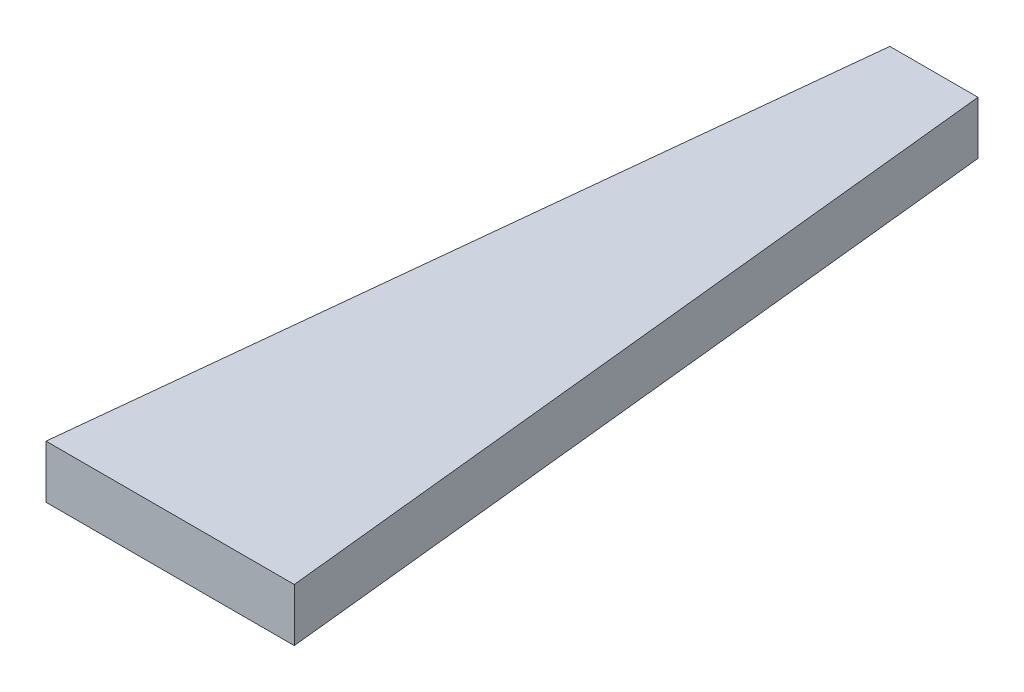
ISO-10303-21;
HEADER;
FILE_DESCRIPTION(('STEP AP214'),'2;1');
FILE_NAME('part.step','',(''),(''),'','','');
FILE_SCHEMA(('AUTOMOTIVE_DESIGN { 1 0 10303 214 1 1 1 1 }'));
ENDSEC;
DATA;
#1=APPLICATION_CONTEXT('core data for automotive mechanical design processes');
#2=APPLICATION_PROTOCOL_DEFINITION('international standard','automotive_design',2000,#1);
#3=PRODUCT_CONTEXT('',#1,'mechanical');
#4=PRODUCT('Part','Part','',(#3));
#5=PRODUCT_RELATED_PRODUCT_CATEGORY('part','',(#4));
#6=PRODUCT_DEFINITION_FORMATION('','',#4);
#7=PRODUCT_DEFINITION_CONTEXT('part definition',#1,'design');
#8=PRODUCT_DEFINITION('design','',#6,#7);
#9=PRODUCT_DEFINITION_SHAPE('','',#8);
#10=(LENGTH_UNIT() NAMED_UNIT(*) SI_UNIT(.MILLI.,.METRE.));
#11=(NAMED_UNIT(*) PLANE_ANGLE_UNIT() SI_UNIT($,.RADIAN.));
#12=(NAMED_UNIT(*) SI_UNIT($,.STERADIAN.) SOLID_ANGLE_UNIT());
#13=UNCERTAINTY_MEASURE_WITH_UNIT(LENGTH_MEASURE(1.E-05),#10,'distance_accuracy_value','');
#14=(GEOMETRIC_REPRESENTATION_CONTEXT(3) GLOBAL_UNCERTAINTY_ASSIGNED_CONTEXT((#13)) GLOBAL_UNIT_ASSIGNED_CONTEXT((#10,
#11,#12)) REPRESENTATION_CONTEXT('',''));
#15=CARTESIAN_POINT('',(0.,0.,0.));
#16=DIRECTION('',(0.,0.,1.));
#17=DIRECTION('',(1.,0.,0.));
#18=AXIS2_PLACEMENT_3D('',#15,#16,#17);
#19=CARTESIAN_POINT('',(29.7693471621072,6.35,0.));
#20=DIRECTION('',(0.,0.,-1.));
#21=DIRECTION('',(-1.,0.,0.));
#22=AXIS2_PLACEMENT_3D('',#19,#20,#21);
#23=PLANE('',#22);
#24=DIRECTION('',(1.,0.,0.));
#25=VECTOR('',#24,1.);
#26=CARTESIAN_POINT('',(29.7693471621072,0.,0.));
#27=LINE('',#26,#25);
#28=CARTESIAN_POINT('',(0.,0.,0.));
#29=VERTEX_POINT('',#28);
#30=CARTESIAN_POINT('',(29.7693471621072,0.,0.));
#31=VERTEX_POINT('',#30);
#32=EDGE_CURVE('E96',#29,#31,#27,.T.);
#33=ORIENTED_EDGE('',*,*,#32,.T.);
#34=DIRECTION('',(0.,-1.,0.));
#35=VECTOR('',#34,1.);
#36=CARTESIAN_POINT('',(29.7693471621072,6.35,0.));
#37=LINE('',#36,#35);
#38=CARTESIAN_POINT('',(29.7693471621072,6.35,0.));
#39=VERTEX_POINT('',#38);
#40=EDGE_CURVE('E11',#39,#31,#37,.T.);
#41=ORIENTED_EDGE('',*,*,#40,.F.);
#42=DIRECTION('',(1.,0.,0.));
#43=VECTOR('',#42,1.);
#44=CARTESIAN_POINT('',(29.7693471621072,6.35,0.));
#45=LINE('',#44,#43);
#46=CARTESIAN_POINT('',(0.,6.35,0.));
#47=VERTEX_POINT('',#46);
#48=EDGE_CURVE('E84',#47,#39,#45,.T.);
#49=ORIENTED_EDGE('',*,*,#48,.F.);
#50=DIRECTION('',(0.,-1.,0.));
#51=VECTOR('',#50,1.);
#52=CARTESIAN_POINT('',(0.,6.35,0.));
#53=LINE('',#52,#51);
#54=EDGE_CURVE('E92',#47,#29,#53,.T.);
#55=ORIENTED_EDGE('',*,*,#54,.T.);
#56=EDGE_LOOP('',(#33,#41,#49,#55));
#57=FACE_BOUND('',#56,.T.);
#58=ADVANCED_FACE('F33',(#57),#23,.F.);
#59=CARTESIAN_POINT('',(20.1696103395712,6.35,-91.5813479250892));
#60=DIRECTION('',(-0.994551040386204,0.,0.104250794081961));
#61=DIRECTION('',(0.104250794081961,0.,0.994551040386204));
#62=AXIS2_PLACEMENT_3D('',#59,#60,#61);
#63=PLANE('',#62);
#64=DIRECTION('',(-0.104250794081961,0.,-0.994551040386204));
#65=VECTOR('',#64,1.);
#66=CARTESIAN_POINT('',(20.1696103395712,0.,-91.5813479250892));
#67=LINE('',#66,#65);
#68=CARTESIAN_POINT('',(20.1696103395712,0.,-91.5813479250892));
#69=VERTEX_POINT('',#68);
#70=EDGE_CURVE('E88',#31,#69,#67,.T.);
#71=ORIENTED_EDGE('',*,*,#70,.T.);
#72=DIRECTION('',(0.,-1.,0.));
#73=VECTOR('',#72,1.);
#74=CARTESIAN_POINT('',(20.1696103395712,6.35,-91.5813479250892));
#75=LINE('',#74,#73);
#76=CARTESIAN_POINT('',(20.1696103395712,6.35,-91.5813479250892));
#77=VERTEX_POINT('',#76);
#78=EDGE_CURVE('E41',#77,#69,#75,.T.);
#79=ORIENTED_EDGE('',*,*,#78,.F.);
#80=DIRECTION('',(-0.104250794081961,0.,-0.994551040386204));
#81=VECTOR('',#80,1.);
#82=CARTESIAN_POINT('',(20.1696103395712,6.35,-91.5813479250892));
#83=LINE('',#82,#81);
#84=EDGE_CURVE('E79',#39,#77,#83,.T.);
#85=ORIENTED_EDGE('',*,*,#84,.F.);
#86=ORIENTED_EDGE('',*,*,#40,.T.);
#87=EDGE_LOOP('',(#71,#79,#85,#86));
#88=FACE_BOUND('',#87,.T.);
#89=ADVANCED_FACE('F87',(#88),#63,.F.);
#90=CARTESIAN_POINT('',(9.59973682253633,6.35,-91.5813479250891));
#91=DIRECTION('',(0.,0.,1.));
#92=DIRECTION('',(1.,0.,0.));
#93=AXIS2_PLACEMENT_3D('',#90,#91,#92);
#94=PLANE('',#93);
#95=DIRECTION('',(-1.,0.,0.));
#96=VECTOR('',#95,1.);
#97=CARTESIAN_POINT('',(9.59973682253633,0.,-91.5813479250891));
#98=LINE('',#97,#96);
#99=CARTESIAN_POINT('',(9.59973682253633,0.,-91.5813479250891));
#100=VERTEX_POINT('',#99);
#101=EDGE_CURVE('E66',#69,#100,#98,.T.);
#102=ORIENTED_EDGE('',*,*,#101,.T.);
#103=DIRECTION('',(0.,-1.,0.));
#104=VECTOR('',#103,1.);
#105=CARTESIAN_POINT('',(9.59973682253633,6.35,-91.5813479250891));
#106=LINE('',#105,#104);
#107=CARTESIAN_POINT('',(9.59973682253633,6.35,-91.5813479250891));
#108=VERTEX_POINT('',#107);
#109=EDGE_CURVE('E89',#108,#100,#106,.T.);
#110=ORIENTED_EDGE('',*,*,#109,.F.);
#111=DIRECTION('',(-1.,0.,0.));
#112=VECTOR('',#111,1.);
#113=CARTESIAN_POINT('',(9.59973682253633,6.35,-91.5813479250891));
#114=LINE('',#113,#112);
#115=EDGE_CURVE('E82',#77,#108,#114,.T.);
#116=ORIENTED_EDGE('',*,*,#115,.F.);
#117=ORIENTED_EDGE('',*,*,#78,.T.);
#118=EDGE_LOOP('',(#102,#110,#116,#117));
#119=FACE_BOUND('',#118,.T.);
#120=ADVANCED_FACE('F90',(#119),#94,.F.);
#121=CARTESIAN_POINT('',(0.,6.35,0.));
#122=DIRECTION('',(0.994551040386203,0.,0.104250794081965));
#123=DIRECTION('',(0.104250794081965,0.,-0.994551040386204));
#124=AXIS2_PLACEMENT_3D('',#121,#122,#123);
#125=PLANE('',#124);
#126=DIRECTION('',(-0.104250794081965,0.,0.994551040386203));
#127=VECTOR('',#126,1.);
#128=CARTESIAN_POINT('',(0.,0.,0.));
#129=LINE('',#128,#127);
#130=EDGE_CURVE('E72',#100,#29,#129,.T.);
#131=ORIENTED_EDGE('',*,*,#130,.T.);
#132=ORIENTED_EDGE('',*,*,#54,.F.);
#133=DIRECTION('',(-0.104250794081965,0.,0.994551040386203));
#134=VECTOR('',#133,1.);
#135=CARTESIAN_POINT('',(0.,6.35,0.));
#136=LINE('',#135,#134);
#137=EDGE_CURVE('E49',#108,#47,#136,.T.);
#138=ORIENTED_EDGE('',*,*,#137,.F.);
#139=ORIENTED_EDGE('',*,*,#109,.T.);
#140=EDGE_LOOP('',(#131,#132,#138,#139));
#141=FACE_BOUND('',#140,.T.);
#142=ADVANCED_FACE('F103',(#141),#125,.F.);
#143=CARTESIAN_POINT('',(0.,6.35,0.));
#144=DIRECTION('',(0.,-1.,0.));
#145=DIRECTION('',(0.,0.,-1.));
#146=AXIS2_PLACEMENT_3D('',#143,#144,#145);
#147=PLANE('',#146);
#148=ORIENTED_EDGE('',*,*,#48,.T.);
#149=ORIENTED_EDGE('',*,*,#84,.T.);
#150=ORIENTED_EDGE('',*,*,#115,.T.);
#151=ORIENTED_EDGE('',*,*,#137,.T.);
#152=EDGE_LOOP('',(#148,#149,#150,#151));
#153=FACE_BOUND('',#152,.T.);
#154=ADVANCED_FACE('F80',(#153),#147,.F.);
#155=CARTESIAN_POINT('',(0.,0.,0.));
#156=DIRECTION('',(0.,-1.,0.));
#157=DIRECTION('',(0.,0.,-1.));
#158=AXIS2_PLACEMENT_3D('',#155,#156,#157);
#159=PLANE('',#158);
#160=ORIENTED_EDGE('',*,*,#32,.F.);
#161=ORIENTED_EDGE('',*,*,#130,.F.);
#162=ORIENTED_EDGE('',*,*,#101,.F.);
#163=ORIENTED_EDGE('',*,*,#70,.F.);
#164=EDGE_LOOP('',(#160,#161,#162,#163));
#165=FACE_BOUND('',#164,.T.);
#166=ADVANCED_FACE('F106',(#165),#159,.T.);
#167=CLOSED_SHELL('',(#58,#89,#120,#142,#154,#166));
#168=MANIFOLD_SOLID_BREP('B2',#167);
#169=ADVANCED_BREP_SHAPE_REPRESENTATION('',(#18,#168),#14);
#170=SHAPE_DEFINITION_REPRESENTATION(#9,#169);
ENDSEC;
END-ISO-10303-21;
